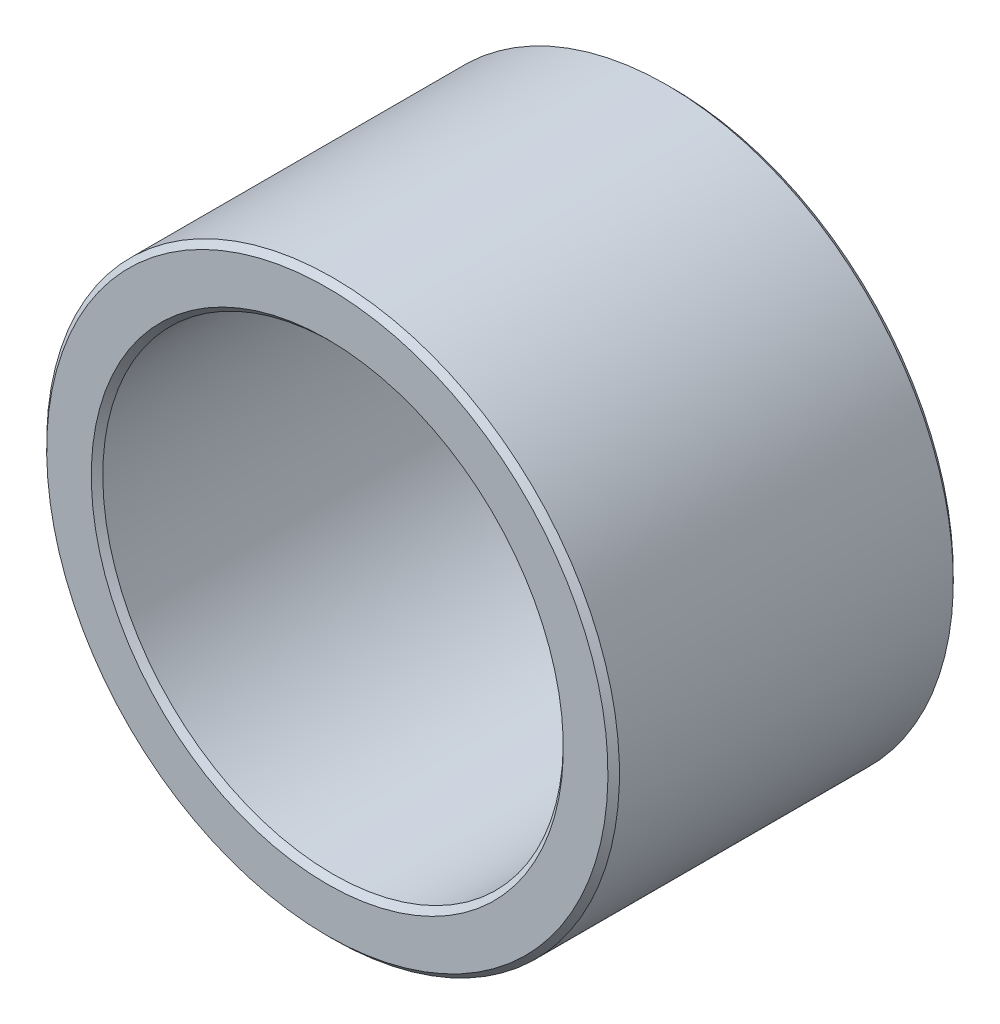
ISO-10303-21;
HEADER;
FILE_DESCRIPTION(('STEP AP214'),'2;1');
FILE_NAME('part.step','',(''),(''),'','','');
FILE_SCHEMA(('AUTOMOTIVE_DESIGN { 1 0 10303 214 1 1 1 1 }'));
ENDSEC;
DATA;
#1=APPLICATION_CONTEXT('core data for automotive mechanical design processes');
#2=APPLICATION_PROTOCOL_DEFINITION('international standard','automotive_design',2000,#1);
#3=PRODUCT_CONTEXT('',#1,'mechanical');
#4=PRODUCT('Part','Part','',(#3));
#5=PRODUCT_RELATED_PRODUCT_CATEGORY('part','',(#4));
#6=PRODUCT_DEFINITION_FORMATION('','',#4);
#7=PRODUCT_DEFINITION_CONTEXT('part definition',#1,'design');
#8=PRODUCT_DEFINITION('design','',#6,#7);
#9=PRODUCT_DEFINITION_SHAPE('','',#8);
#10=(LENGTH_UNIT() NAMED_UNIT(*) SI_UNIT(.MILLI.,.METRE.));
#11=(NAMED_UNIT(*) PLANE_ANGLE_UNIT() SI_UNIT($,.RADIAN.));
#12=(NAMED_UNIT(*) SI_UNIT($,.STERADIAN.) SOLID_ANGLE_UNIT());
#13=UNCERTAINTY_MEASURE_WITH_UNIT(LENGTH_MEASURE(1.E-05),#10,'distance_accuracy_value','');
#14=(GEOMETRIC_REPRESENTATION_CONTEXT(3) GLOBAL_UNCERTAINTY_ASSIGNED_CONTEXT((#13)) GLOBAL_UNIT_ASSIGNED_CONTEXT((#10,
#11,#12)) REPRESENTATION_CONTEXT('',''));
#15=CARTESIAN_POINT('',(0.,0.,0.));
#16=DIRECTION('',(0.,0.,1.));
#17=DIRECTION('',(1.,0.,0.));
#18=AXIS2_PLACEMENT_3D('',#15,#16,#17);
#19=CARTESIAN_POINT('',(0.,0.,-3.));
#20=DIRECTION('',(0.,0.,1.));
#21=DIRECTION('',(0.,-1.,0.));
#22=AXIS2_PLACEMENT_3D('',#19,#20,#21);
#23=PLANE('',#22);
#24=CARTESIAN_POINT('',(0.,0.,-3.00000000001));
#25=DIRECTION('',(0.,0.,1.));
#26=DIRECTION('',(0.,-1.,0.));
#27=AXIS2_PLACEMENT_3D('',#24,#25,#26);
#28=CIRCLE('',#27,4.10000000001);
#29=CARTESIAN_POINT('',(0.,-4.10000000001,-3.00000000001));
#30=VERTEX_POINT('',#29);
#31=EDGE_CURVE('E78',#30,#30,#28,.T.);
#32=ORIENTED_EDGE('',*,*,#31,.T.);
#33=EDGE_LOOP('',(#32));
#34=FACE_BOUND('',#33,.T.);
#35=CARTESIAN_POINT('',(0.,0.,-3.00000000001));
#36=DIRECTION('',(0.,0.,-1.));
#37=DIRECTION('',(0.,-1.,0.));
#38=AXIS2_PLACEMENT_3D('',#35,#36,#37);
#39=CIRCLE('',#38,4.87500000001);
#40=CARTESIAN_POINT('',(0.,-4.87500000001,-3.00000000001));
#41=VERTEX_POINT('',#40);
#42=EDGE_CURVE('E11',#41,#41,#39,.T.);
#43=ORIENTED_EDGE('',*,*,#42,.T.);
#44=EDGE_LOOP('',(#43));
#45=FACE_BOUND('',#44,.T.);
#46=ADVANCED_FACE('F17',(#34,#45),#23,.F.);
#47=CARTESIAN_POINT('',(0.,0.,3.));
#48=DIRECTION('',(0.,0.,1.));
#49=DIRECTION('',(0.,-1.,0.));
#50=AXIS2_PLACEMENT_3D('',#47,#48,#49);
#51=PLANE('',#50);
#52=CARTESIAN_POINT('',(0.,0.,3.00000000001));
#53=DIRECTION('',(0.,0.,-1.));
#54=DIRECTION('',(0.,-1.,0.));
#55=AXIS2_PLACEMENT_3D('',#52,#53,#54);
#56=CIRCLE('',#55,4.10000000001);
#57=CARTESIAN_POINT('',(0.,-4.10000000001,3.00000000001));
#58=VERTEX_POINT('',#57);
#59=EDGE_CURVE('E90',#58,#58,#56,.T.);
#60=ORIENTED_EDGE('',*,*,#59,.T.);
#61=EDGE_LOOP('',(#60));
#62=FACE_BOUND('',#61,.T.);
#63=CARTESIAN_POINT('',(0.,0.,3.00000000001));
#64=DIRECTION('',(0.,0.,1.));
#65=DIRECTION('',(0.,-1.,0.));
#66=AXIS2_PLACEMENT_3D('',#63,#64,#65);
#67=CIRCLE('',#66,4.87500000001);
#68=CARTESIAN_POINT('',(0.,-4.87500000001,3.00000000001));
#69=VERTEX_POINT('',#68);
#70=EDGE_CURVE('E70',#69,#69,#67,.T.);
#71=ORIENTED_EDGE('',*,*,#70,.T.);
#72=EDGE_LOOP('',(#71));
#73=FACE_BOUND('',#72,.T.);
#74=ADVANCED_FACE('F183',(#62,#73),#51,.T.);
#75=CARTESIAN_POINT('',(0.,0.,3.));
#76=DIRECTION('',(0.,0.,-1.));
#77=DIRECTION('',(0.,1.,0.));
#78=AXIS2_PLACEMENT_3D('',#75,#76,#77);
#79=CYLINDRICAL_SURFACE('',#78,4.975);
#80=CARTESIAN_POINT('',(0.,0.,2.90000000001));
#81=DIRECTION('',(0.,0.,-1.));
#82=DIRECTION('',(0.,-1.,0.));
#83=AXIS2_PLACEMENT_3D('',#80,#81,#82);
#84=CIRCLE('',#83,4.97500000001);
#85=CARTESIAN_POINT('',(0.,-4.97500000001,2.90000000001));
#86=VERTEX_POINT('',#85);
#87=EDGE_CURVE('E66',#86,#86,#84,.T.);
#88=ORIENTED_EDGE('',*,*,#87,.T.);
#89=EDGE_LOOP('',(#88));
#90=FACE_BOUND('',#89,.T.);
#91=CARTESIAN_POINT('',(0.,0.,-2.90000000001));
#92=DIRECTION('',(0.,0.,1.));
#93=DIRECTION('',(0.,-1.,0.));
#94=AXIS2_PLACEMENT_3D('',#91,#92,#93);
#95=CIRCLE('',#94,4.97500000001);
#96=CARTESIAN_POINT('',(0.,-4.97500000001,-2.90000000001));
#97=VERTEX_POINT('',#96);
#98=EDGE_CURVE('E25',#97,#97,#95,.T.);
#99=ORIENTED_EDGE('',*,*,#98,.T.);
#100=EDGE_LOOP('',(#99));
#101=FACE_BOUND('',#100,.T.);
#102=ADVANCED_FACE('F67',(#90,#101),#79,.T.);
#103=CARTESIAN_POINT('',(0.,0.,3.));
#104=DIRECTION('',(0.,0.,-1.));
#105=DIRECTION('',(0.,1.,0.));
#106=AXIS2_PLACEMENT_3D('',#103,#104,#105);
#107=CYLINDRICAL_SURFACE('',#106,4.);
#108=CARTESIAN_POINT('',(0.,0.,2.90000000001));
#109=DIRECTION('',(0.,0.,1.));
#110=DIRECTION('',(0.,-1.,0.));
#111=AXIS2_PLACEMENT_3D('',#108,#109,#110);
#112=CIRCLE('',#111,4.00000000001);
#113=CARTESIAN_POINT('',(0.,-4.00000000001,2.90000000001001));
#114=VERTEX_POINT('',#113);
#115=EDGE_CURVE('E82',#114,#114,#112,.T.);
#116=ORIENTED_EDGE('',*,*,#115,.T.);
#117=EDGE_LOOP('',(#116));
#118=FACE_BOUND('',#117,.T.);
#119=CARTESIAN_POINT('',(0.,0.,-2.90000000001));
#120=DIRECTION('',(0.,0.,-1.));
#121=DIRECTION('',(0.,-1.,0.));
#122=AXIS2_PLACEMENT_3D('',#119,#120,#121);
#123=CIRCLE('',#122,4.00000000001);
#124=CARTESIAN_POINT('',(0.,-4.00000000001,-2.90000000001));
#125=VERTEX_POINT('',#124);
#126=EDGE_CURVE('E71',#125,#125,#123,.T.);
#127=ORIENTED_EDGE('',*,*,#126,.T.);
#128=EDGE_LOOP('',(#127));
#129=FACE_BOUND('',#128,.T.);
#130=ADVANCED_FACE('F160',(#118,#129),#107,.F.);
#131=CARTESIAN_POINT('',(0.,0.,-2.9));
#132=DIRECTION('',(0.,0.,1.));
#133=DIRECTION('',(0.,-1.,0.));
#134=AXIS2_PLACEMENT_3D('',#131,#132,#133);
#135=CONICAL_SURFACE('',#134,4.975,0.785398163397443);
#136=ORIENTED_EDGE('',*,*,#42,.F.);
#137=EDGE_LOOP('',(#136));
#138=FACE_BOUND('',#137,.T.);
#139=ORIENTED_EDGE('',*,*,#98,.F.);
#140=EDGE_LOOP('',(#139));
#141=FACE_BOUND('',#140,.T.);
#142=ADVANCED_FACE('F152',(#138,#141),#135,.T.);
#143=CARTESIAN_POINT('',(0.,0.,3.));
#144=DIRECTION('',(0.,0.,-1.));
#145=DIRECTION('',(0.,1.,0.));
#146=AXIS2_PLACEMENT_3D('',#143,#144,#145);
#147=CONICAL_SURFACE('',#146,4.875,0.785398163397452);
#148=ORIENTED_EDGE('',*,*,#70,.F.);
#149=EDGE_LOOP('',(#148));
#150=FACE_BOUND('',#149,.T.);
#151=ORIENTED_EDGE('',*,*,#87,.F.);
#152=EDGE_LOOP('',(#151));
#153=FACE_BOUND('',#152,.T.);
#154=ADVANCED_FACE('F141',(#150,#153),#147,.T.);
#155=CARTESIAN_POINT('',(0.,0.,-3.));
#156=DIRECTION('',(0.,0.,-1.));
#157=DIRECTION('',(0.,1.,0.));
#158=AXIS2_PLACEMENT_3D('',#155,#156,#157);
#159=CONICAL_SURFACE('',#158,4.1,0.785398163397452);
#160=ORIENTED_EDGE('',*,*,#126,.F.);
#161=EDGE_LOOP('',(#160));
#162=FACE_BOUND('',#161,.T.);
#163=ORIENTED_EDGE('',*,*,#31,.F.);
#164=EDGE_LOOP('',(#163));
#165=FACE_BOUND('',#164,.T.);
#166=ADVANCED_FACE('F130',(#162,#165),#159,.F.);
#167=CARTESIAN_POINT('',(0.,0.,2.9));
#168=DIRECTION('',(0.,0.,1.));
#169=DIRECTION('',(0.,-1.,0.));
#170=AXIS2_PLACEMENT_3D('',#167,#168,#169);
#171=CONICAL_SURFACE('',#170,4.,0.785398163397452);
#172=ORIENTED_EDGE('',*,*,#115,.F.);
#173=EDGE_LOOP('',(#172));
#174=FACE_BOUND('',#173,.T.);
#175=ORIENTED_EDGE('',*,*,#59,.F.);
#176=EDGE_LOOP('',(#175));
#177=FACE_BOUND('',#176,.T.);
#178=ADVANCED_FACE('F126',(#174,#177),#171,.F.);
#179=CLOSED_SHELL('',(#46,#74,#102,#130,#142,#154,#166,#178));
#180=MANIFOLD_SOLID_BREP('B1',#179);
#181=ADVANCED_BREP_SHAPE_REPRESENTATION('',(#18,#180),#14);
#182=SHAPE_DEFINITION_REPRESENTATION(#9,#181);
ENDSEC;
END-ISO-10303-21;
